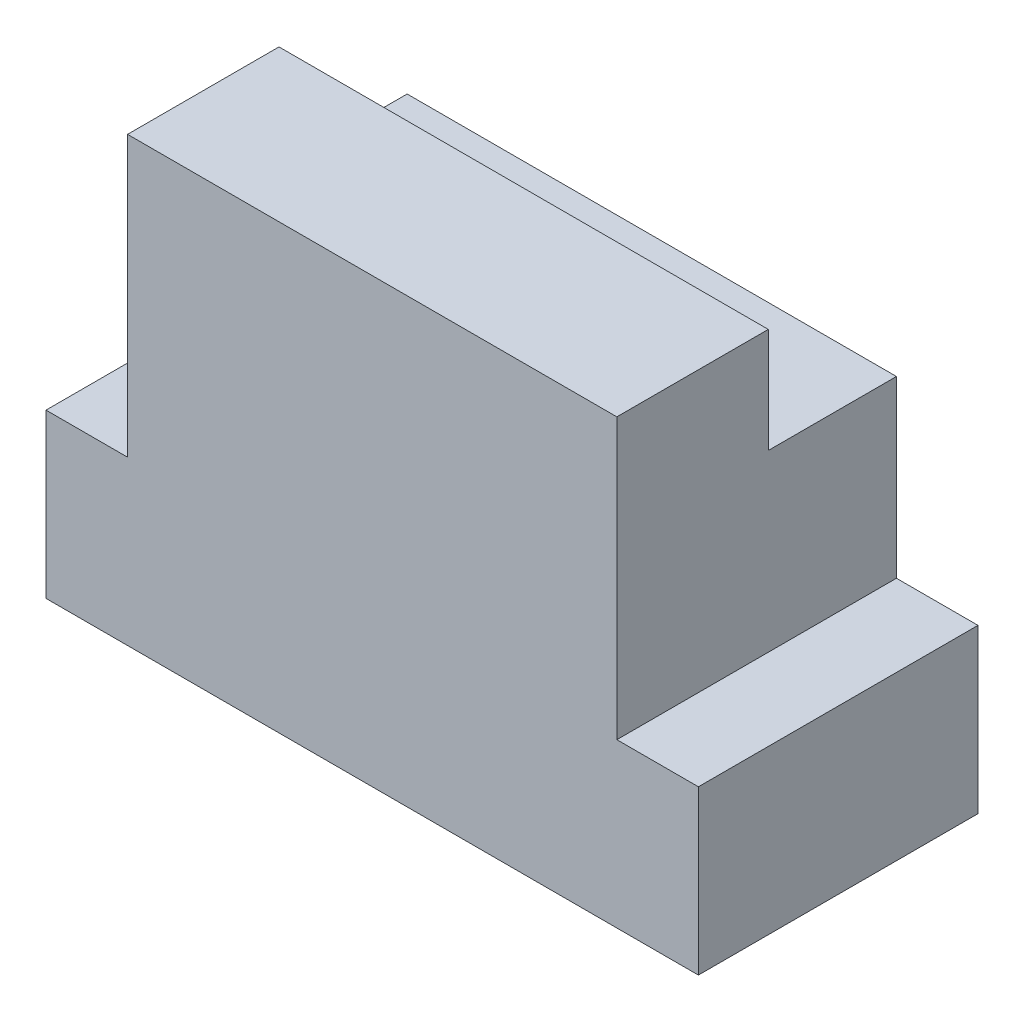
ISO-10303-21;
HEADER;
FILE_DESCRIPTION(('STEP AP214'),'2;1');
FILE_NAME('part.step','',(''),(''),'','','');
FILE_SCHEMA(('AUTOMOTIVE_DESIGN { 1 0 10303 214 1 1 1 1 }'));
ENDSEC;
DATA;
#1=APPLICATION_CONTEXT('core data for automotive mechanical design processes');
#2=APPLICATION_PROTOCOL_DEFINITION('international standard','automotive_design',2000,#1);
#3=PRODUCT_CONTEXT('',#1,'mechanical');
#4=PRODUCT('Part','Part','',(#3));
#5=PRODUCT_RELATED_PRODUCT_CATEGORY('part','',(#4));
#6=PRODUCT_DEFINITION_FORMATION('','',#4);
#7=PRODUCT_DEFINITION_CONTEXT('part definition',#1,'design');
#8=PRODUCT_DEFINITION('design','',#6,#7);
#9=PRODUCT_DEFINITION_SHAPE('','',#8);
#10=(LENGTH_UNIT() NAMED_UNIT(*) SI_UNIT(.MILLI.,.METRE.));
#11=(NAMED_UNIT(*) PLANE_ANGLE_UNIT() SI_UNIT($,.RADIAN.));
#12=(NAMED_UNIT(*) SI_UNIT($,.STERADIAN.) SOLID_ANGLE_UNIT());
#13=UNCERTAINTY_MEASURE_WITH_UNIT(LENGTH_MEASURE(1.E-05),#10,'distance_accuracy_value','');
#14=(GEOMETRIC_REPRESENTATION_CONTEXT(3) GLOBAL_UNCERTAINTY_ASSIGNED_CONTEXT((#13)) GLOBAL_UNIT_ASSIGNED_CONTEXT((#10,
#11,#12)) REPRESENTATION_CONTEXT('',''));
#15=CARTESIAN_POINT('',(0.,0.,0.));
#16=DIRECTION('',(0.,0.,1.));
#17=DIRECTION('',(1.,0.,0.));
#18=AXIS2_PLACEMENT_3D('',#15,#16,#17);
#19=CARTESIAN_POINT('',(0.,14.,0.));
#20=DIRECTION('',(0.,-1.,0.));
#21=DIRECTION('',(0.,0.,-1.));
#22=AXIS2_PLACEMENT_3D('',#19,#20,#21);
#23=PLANE('',#22);
#24=DIRECTION('',(-1.,0.,0.));
#25=VECTOR('',#24,1.);
#26=CARTESIAN_POINT('',(-28.,14.,-12.));
#27=LINE('',#26,#25);
#28=CARTESIAN_POINT('',(28.,14.,-12.));
#29=VERTEX_POINT('',#28);
#30=CARTESIAN_POINT('',(21.,14.,-12.));
#31=VERTEX_POINT('',#30);
#32=EDGE_CURVE('E157',#29,#31,#27,.T.);
#33=ORIENTED_EDGE('',*,*,#32,.T.);
#34=DIRECTION('',(0.,0.,-1.));
#35=VECTOR('',#34,1.);
#36=CARTESIAN_POINT('',(21.,14.,12.));
#37=LINE('',#36,#35);
#38=CARTESIAN_POINT('',(21.,14.,12.));
#39=VERTEX_POINT('',#38);
#40=EDGE_CURVE('E56',#39,#31,#37,.T.);
#41=ORIENTED_EDGE('',*,*,#40,.F.);
#42=DIRECTION('',(1.,0.,0.));
#43=VECTOR('',#42,1.);
#44=CARTESIAN_POINT('',(-28.,14.,12.));
#45=LINE('',#44,#43);
#46=CARTESIAN_POINT('',(28.,14.,12.));
#47=VERTEX_POINT('',#46);
#48=EDGE_CURVE('E161',#39,#47,#45,.T.);
#49=ORIENTED_EDGE('',*,*,#48,.T.);
#50=DIRECTION('',(0.,0.,-1.));
#51=VECTOR('',#50,1.);
#52=CARTESIAN_POINT('',(28.,14.,12.));
#53=LINE('',#52,#51);
#54=EDGE_CURVE('E152',#47,#29,#53,.T.);
#55=ORIENTED_EDGE('',*,*,#54,.T.);
#56=EDGE_LOOP('',(#33,#41,#49,#55));
#57=FACE_BOUND('',#56,.T.);
#58=ADVANCED_FACE('F41',(#57),#23,.F.);
#59=DIRECTION('',(0.,0.,1.));
#60=VECTOR('',#59,1.);
#61=CARTESIAN_POINT('',(-21.,14.,12.));
#62=LINE('',#61,#60);
#63=CARTESIAN_POINT('',(-21.,14.,-12.));
#64=VERTEX_POINT('',#63);
#65=CARTESIAN_POINT('',(-21.,14.,12.));
#66=VERTEX_POINT('',#65);
#67=EDGE_CURVE('E202',#64,#66,#62,.T.);
#68=ORIENTED_EDGE('',*,*,#67,.F.);
#69=CARTESIAN_POINT('',(-28.,14.,-12.));
#70=VERTEX_POINT('',#69);
#71=EDGE_CURVE('E155',#64,#70,#27,.T.);
#72=ORIENTED_EDGE('',*,*,#71,.T.);
#73=DIRECTION('',(0.,0.,1.));
#74=VECTOR('',#73,1.);
#75=CARTESIAN_POINT('',(-28.,14.,12.));
#76=LINE('',#75,#74);
#77=CARTESIAN_POINT('',(-28.,14.,12.));
#78=VERTEX_POINT('',#77);
#79=EDGE_CURVE('E159',#70,#78,#76,.T.);
#80=ORIENTED_EDGE('',*,*,#79,.T.);
#81=EDGE_CURVE('E64',#78,#66,#45,.T.);
#82=ORIENTED_EDGE('',*,*,#81,.T.);
#83=EDGE_LOOP('',(#68,#72,#80,#82));
#84=FACE_BOUND('',#83,.T.);
#85=ADVANCED_FACE('F231',(#84),#23,.F.);
#86=CARTESIAN_POINT('',(21.,38.,-1.));
#87=DIRECTION('',(0.,0.,1.));
#88=DIRECTION('',(1.,0.,0.));
#89=AXIS2_PLACEMENT_3D('',#86,#87,#88);
#90=PLANE('',#89);
#91=DIRECTION('',(1.,0.,0.));
#92=VECTOR('',#91,1.);
#93=CARTESIAN_POINT('',(21.,29.,-1.));
#94=LINE('',#93,#92);
#95=CARTESIAN_POINT('',(-21.,29.,-0.999999999999996));
#96=VERTEX_POINT('',#95);
#97=CARTESIAN_POINT('',(21.,29.,-1.));
#98=VERTEX_POINT('',#97);
#99=EDGE_CURVE('E129',#96,#98,#94,.T.);
#100=ORIENTED_EDGE('',*,*,#99,.F.);
#101=DIRECTION('',(0.,-1.,0.));
#102=VECTOR('',#101,1.);
#103=CARTESIAN_POINT('',(-21.,38.,-0.999999999999996));
#104=LINE('',#103,#102);
#105=CARTESIAN_POINT('',(-21.,38.,-0.999999999999996));
#106=VERTEX_POINT('',#105);
#107=EDGE_CURVE('E143',#106,#96,#104,.T.);
#108=ORIENTED_EDGE('',*,*,#107,.F.);
#109=DIRECTION('',(-1.,0.,0.));
#110=VECTOR('',#109,1.);
#111=CARTESIAN_POINT('',(21.,38.,-1.));
#112=LINE('',#111,#110);
#113=CARTESIAN_POINT('',(21.,38.,-1.));
#114=VERTEX_POINT('',#113);
#115=EDGE_CURVE('E140',#114,#106,#112,.T.);
#116=ORIENTED_EDGE('',*,*,#115,.F.);
#117=DIRECTION('',(0.,-1.,0.));
#118=VECTOR('',#117,1.);
#119=CARTESIAN_POINT('',(21.,38.,-1.));
#120=LINE('',#119,#118);
#121=EDGE_CURVE('E123',#114,#98,#120,.T.);
#122=ORIENTED_EDGE('',*,*,#121,.T.);
#123=EDGE_LOOP('',(#100,#108,#116,#122));
#124=FACE_BOUND('',#123,.T.);
#125=ADVANCED_FACE('F139',(#124),#90,.F.);
#126=CARTESIAN_POINT('',(28.,14.,12.));
#127=DIRECTION('',(-1.,0.,0.));
#128=DIRECTION('',(0.,0.,1.));
#129=AXIS2_PLACEMENT_3D('',#126,#127,#128);
#130=PLANE('',#129);
#131=DIRECTION('',(0.,0.,-1.));
#132=VECTOR('',#131,1.);
#133=CARTESIAN_POINT('',(28.,0.,12.));
#134=LINE('',#133,#132);
#135=CARTESIAN_POINT('',(28.,0.,12.));
#136=VERTEX_POINT('',#135);
#137=CARTESIAN_POINT('',(28.,0.,-12.));
#138=VERTEX_POINT('',#137);
#139=EDGE_CURVE('E142',#136,#138,#134,.T.);
#140=ORIENTED_EDGE('',*,*,#139,.T.);
#141=DIRECTION('',(0.,-1.,0.));
#142=VECTOR('',#141,1.);
#143=CARTESIAN_POINT('',(28.,14.,-12.));
#144=LINE('',#143,#142);
#145=EDGE_CURVE('E11',#29,#138,#144,.T.);
#146=ORIENTED_EDGE('',*,*,#145,.F.);
#147=ORIENTED_EDGE('',*,*,#54,.F.);
#148=DIRECTION('',(0.,-1.,0.));
#149=VECTOR('',#148,1.);
#150=CARTESIAN_POINT('',(28.,14.,12.));
#151=LINE('',#150,#149);
#152=EDGE_CURVE('E162',#47,#136,#151,.T.);
#153=ORIENTED_EDGE('',*,*,#152,.T.);
#154=EDGE_LOOP('',(#140,#146,#147,#153));
#155=FACE_BOUND('',#154,.T.);
#156=ADVANCED_FACE('F43',(#155),#130,.F.);
#157=CARTESIAN_POINT('',(-28.,14.,-12.));
#158=DIRECTION('',(0.,0.,1.));
#159=DIRECTION('',(1.,0.,0.));
#160=AXIS2_PLACEMENT_3D('',#157,#158,#159);
#161=PLANE('',#160);
#162=DIRECTION('',(-1.,0.,0.));
#163=VECTOR('',#162,1.);
#164=CARTESIAN_POINT('',(-28.,0.,-12.));
#165=LINE('',#164,#163);
#166=CARTESIAN_POINT('',(-28.,0.,-12.));
#167=VERTEX_POINT('',#166);
#168=EDGE_CURVE('E146',#138,#167,#165,.T.);
#169=ORIENTED_EDGE('',*,*,#168,.T.);
#170=DIRECTION('',(0.,-1.,0.));
#171=VECTOR('',#170,1.);
#172=CARTESIAN_POINT('',(-28.,14.,-12.));
#173=LINE('',#172,#171);
#174=EDGE_CURVE('E49',#70,#167,#173,.T.);
#175=ORIENTED_EDGE('',*,*,#174,.F.);
#176=ORIENTED_EDGE('',*,*,#71,.F.);
#177=DIRECTION('',(0.,-1.,0.));
#178=VECTOR('',#177,1.);
#179=CARTESIAN_POINT('',(-21.,29.,-12.));
#180=LINE('',#179,#178);
#181=CARTESIAN_POINT('',(-21.,29.,-12.));
#182=VERTEX_POINT('',#181);
#183=EDGE_CURVE('E209',#182,#64,#180,.T.);
#184=ORIENTED_EDGE('',*,*,#183,.F.);
#185=DIRECTION('',(-1.,0.,0.));
#186=VECTOR('',#185,1.);
#187=CARTESIAN_POINT('',(-21.,29.,-12.));
#188=LINE('',#187,#186);
#189=CARTESIAN_POINT('',(21.,29.,-12.));
#190=VERTEX_POINT('',#189);
#191=EDGE_CURVE('E128',#190,#182,#188,.T.);
#192=ORIENTED_EDGE('',*,*,#191,.F.);
#193=DIRECTION('',(0.,-1.,0.));
#194=VECTOR('',#193,1.);
#195=CARTESIAN_POINT('',(21.,29.,-12.));
#196=LINE('',#195,#194);
#197=EDGE_CURVE('E125',#190,#31,#196,.T.);
#198=ORIENTED_EDGE('',*,*,#197,.T.);
#199=ORIENTED_EDGE('',*,*,#32,.F.);
#200=ORIENTED_EDGE('',*,*,#145,.T.);
#201=EDGE_LOOP('',(#169,#175,#176,#184,#192,#198,#199,#200));
#202=FACE_BOUND('',#201,.T.);
#203=ADVANCED_FACE('F214',(#202),#161,.F.);
#204=CARTESIAN_POINT('',(-28.,14.,12.));
#205=DIRECTION('',(1.,0.,0.));
#206=DIRECTION('',(0.,0.,-1.));
#207=AXIS2_PLACEMENT_3D('',#204,#205,#206);
#208=PLANE('',#207);
#209=DIRECTION('',(0.,0.,1.));
#210=VECTOR('',#209,1.);
#211=CARTESIAN_POINT('',(-28.,0.,12.));
#212=LINE('',#211,#210);
#213=CARTESIAN_POINT('',(-28.,0.,12.));
#214=VERTEX_POINT('',#213);
#215=EDGE_CURVE('E165',#167,#214,#212,.T.);
#216=ORIENTED_EDGE('',*,*,#215,.T.);
#217=DIRECTION('',(0.,-1.,0.));
#218=VECTOR('',#217,1.);
#219=CARTESIAN_POINT('',(-28.,14.,12.));
#220=LINE('',#219,#218);
#221=EDGE_CURVE('E170',#78,#214,#220,.T.);
#222=ORIENTED_EDGE('',*,*,#221,.F.);
#223=ORIENTED_EDGE('',*,*,#79,.F.);
#224=ORIENTED_EDGE('',*,*,#174,.T.);
#225=EDGE_LOOP('',(#216,#222,#223,#224));
#226=FACE_BOUND('',#225,.T.);
#227=ADVANCED_FACE('F177',(#226),#208,.F.);
#228=CARTESIAN_POINT('',(-28.,14.,12.));
#229=DIRECTION('',(0.,0.,-1.));
#230=DIRECTION('',(-1.,0.,0.));
#231=AXIS2_PLACEMENT_3D('',#228,#229,#230);
#232=PLANE('',#231);
#233=DIRECTION('',(1.,0.,0.));
#234=VECTOR('',#233,1.);
#235=CARTESIAN_POINT('',(-28.,0.,12.));
#236=LINE('',#235,#234);
#237=EDGE_CURVE('E156',#214,#136,#236,.T.);
#238=ORIENTED_EDGE('',*,*,#237,.T.);
#239=ORIENTED_EDGE('',*,*,#152,.F.);
#240=ORIENTED_EDGE('',*,*,#48,.F.);
#241=DIRECTION('',(0.,-1.,0.));
#242=VECTOR('',#241,1.);
#243=CARTESIAN_POINT('',(21.,38.,12.));
#244=LINE('',#243,#242);
#245=CARTESIAN_POINT('',(21.,38.,12.));
#246=VERTEX_POINT('',#245);
#247=EDGE_CURVE('E194',#246,#39,#244,.T.);
#248=ORIENTED_EDGE('',*,*,#247,.F.);
#249=DIRECTION('',(1.,0.,0.));
#250=VECTOR('',#249,1.);
#251=CARTESIAN_POINT('',(-21.,38.,12.));
#252=LINE('',#251,#250);
#253=CARTESIAN_POINT('',(-21.,38.,12.));
#254=VERTEX_POINT('',#253);
#255=EDGE_CURVE('E196',#254,#246,#252,.T.);
#256=ORIENTED_EDGE('',*,*,#255,.F.);
#257=DIRECTION('',(0.,-1.,0.));
#258=VECTOR('',#257,1.);
#259=CARTESIAN_POINT('',(-21.,38.,12.));
#260=LINE('',#259,#258);
#261=EDGE_CURVE('E148',#254,#66,#260,.T.);
#262=ORIENTED_EDGE('',*,*,#261,.T.);
#263=ORIENTED_EDGE('',*,*,#81,.F.);
#264=ORIENTED_EDGE('',*,*,#221,.T.);
#265=EDGE_LOOP('',(#238,#239,#240,#248,#256,#262,#263,#264));
#266=FACE_BOUND('',#265,.T.);
#267=ADVANCED_FACE('F187',(#266),#232,.F.);
#268=CARTESIAN_POINT('',(0.,0.,0.));
#269=DIRECTION('',(0.,-1.,0.));
#270=DIRECTION('',(0.,0.,-1.));
#271=AXIS2_PLACEMENT_3D('',#268,#269,#270);
#272=PLANE('',#271);
#273=ORIENTED_EDGE('',*,*,#139,.F.);
#274=ORIENTED_EDGE('',*,*,#237,.F.);
#275=ORIENTED_EDGE('',*,*,#215,.F.);
#276=ORIENTED_EDGE('',*,*,#168,.F.);
#277=EDGE_LOOP('',(#273,#274,#275,#276));
#278=FACE_BOUND('',#277,.T.);
#279=ADVANCED_FACE('F184',(#278),#272,.T.);
#280=CARTESIAN_POINT('',(21.,38.,12.));
#281=DIRECTION('',(-1.,0.,0.));
#282=DIRECTION('',(0.,0.,1.));
#283=AXIS2_PLACEMENT_3D('',#280,#281,#282);
#284=PLANE('',#283);
#285=ORIENTED_EDGE('',*,*,#40,.T.);
#286=ORIENTED_EDGE('',*,*,#197,.F.);
#287=DIRECTION('',(0.,0.,-1.));
#288=VECTOR('',#287,1.);
#289=CARTESIAN_POINT('',(21.,29.,-12.));
#290=LINE('',#289,#288);
#291=EDGE_CURVE('E118',#98,#190,#290,.T.);
#292=ORIENTED_EDGE('',*,*,#291,.F.);
#293=ORIENTED_EDGE('',*,*,#121,.F.);
#294=DIRECTION('',(0.,0.,-1.));
#295=VECTOR('',#294,1.);
#296=CARTESIAN_POINT('',(21.,38.,12.));
#297=LINE('',#296,#295);
#298=EDGE_CURVE('E195',#246,#114,#297,.T.);
#299=ORIENTED_EDGE('',*,*,#298,.F.);
#300=ORIENTED_EDGE('',*,*,#247,.T.);
#301=EDGE_LOOP('',(#285,#286,#292,#293,#299,#300));
#302=FACE_BOUND('',#301,.T.);
#303=ADVANCED_FACE('F120',(#302),#284,.F.);
#304=CARTESIAN_POINT('',(-21.,38.,12.));
#305=DIRECTION('',(1.,0.,0.));
#306=DIRECTION('',(0.,0.,-1.));
#307=AXIS2_PLACEMENT_3D('',#304,#305,#306);
#308=PLANE('',#307);
#309=ORIENTED_EDGE('',*,*,#67,.T.);
#310=ORIENTED_EDGE('',*,*,#261,.F.);
#311=DIRECTION('',(0.,0.,1.));
#312=VECTOR('',#311,1.);
#313=CARTESIAN_POINT('',(-21.,38.,12.));
#314=LINE('',#313,#312);
#315=EDGE_CURVE('E199',#106,#254,#314,.T.);
#316=ORIENTED_EDGE('',*,*,#315,.F.);
#317=ORIENTED_EDGE('',*,*,#107,.T.);
#318=DIRECTION('',(0.,0.,1.));
#319=VECTOR('',#318,1.);
#320=CARTESIAN_POINT('',(-21.,29.,-0.999999999999996));
#321=LINE('',#320,#319);
#322=EDGE_CURVE('E134',#182,#96,#321,.T.);
#323=ORIENTED_EDGE('',*,*,#322,.F.);
#324=ORIENTED_EDGE('',*,*,#183,.T.);
#325=EDGE_LOOP('',(#309,#310,#316,#317,#323,#324));
#326=FACE_BOUND('',#325,.T.);
#327=ADVANCED_FACE('F216',(#326),#308,.F.);
#328=CARTESIAN_POINT('',(0.,38.,0.));
#329=DIRECTION('',(0.,1.,0.));
#330=DIRECTION('',(0.,0.,1.));
#331=AXIS2_PLACEMENT_3D('',#328,#329,#330);
#332=PLANE('',#331);
#333=ORIENTED_EDGE('',*,*,#298,.T.);
#334=ORIENTED_EDGE('',*,*,#115,.T.);
#335=ORIENTED_EDGE('',*,*,#315,.T.);
#336=ORIENTED_EDGE('',*,*,#255,.T.);
#337=EDGE_LOOP('',(#333,#334,#335,#336));
#338=FACE_BOUND('',#337,.T.);
#339=ADVANCED_FACE('F220',(#338),#332,.T.);
#340=CARTESIAN_POINT('',(0.,29.,0.));
#341=DIRECTION('',(0.,-1.,0.));
#342=DIRECTION('',(0.,0.,-1.));
#343=AXIS2_PLACEMENT_3D('',#340,#341,#342);
#344=PLANE('',#343);
#345=ORIENTED_EDGE('',*,*,#99,.T.);
#346=ORIENTED_EDGE('',*,*,#291,.T.);
#347=ORIENTED_EDGE('',*,*,#191,.T.);
#348=ORIENTED_EDGE('',*,*,#322,.T.);
#349=EDGE_LOOP('',(#345,#346,#347,#348));
#350=FACE_BOUND('',#349,.T.);
#351=ADVANCED_FACE('F132',(#350),#344,.F.);
#352=CLOSED_SHELL('',(#58,#85,#125,#156,#203,#227,#267,#279,#303,#327,#339,#351));
#353=MANIFOLD_SOLID_BREP('B2',#352);
#354=ADVANCED_BREP_SHAPE_REPRESENTATION('',(#18,#353),#14);
#355=SHAPE_DEFINITION_REPRESENTATION(#9,#354);
ENDSEC;
END-ISO-10303-21;
